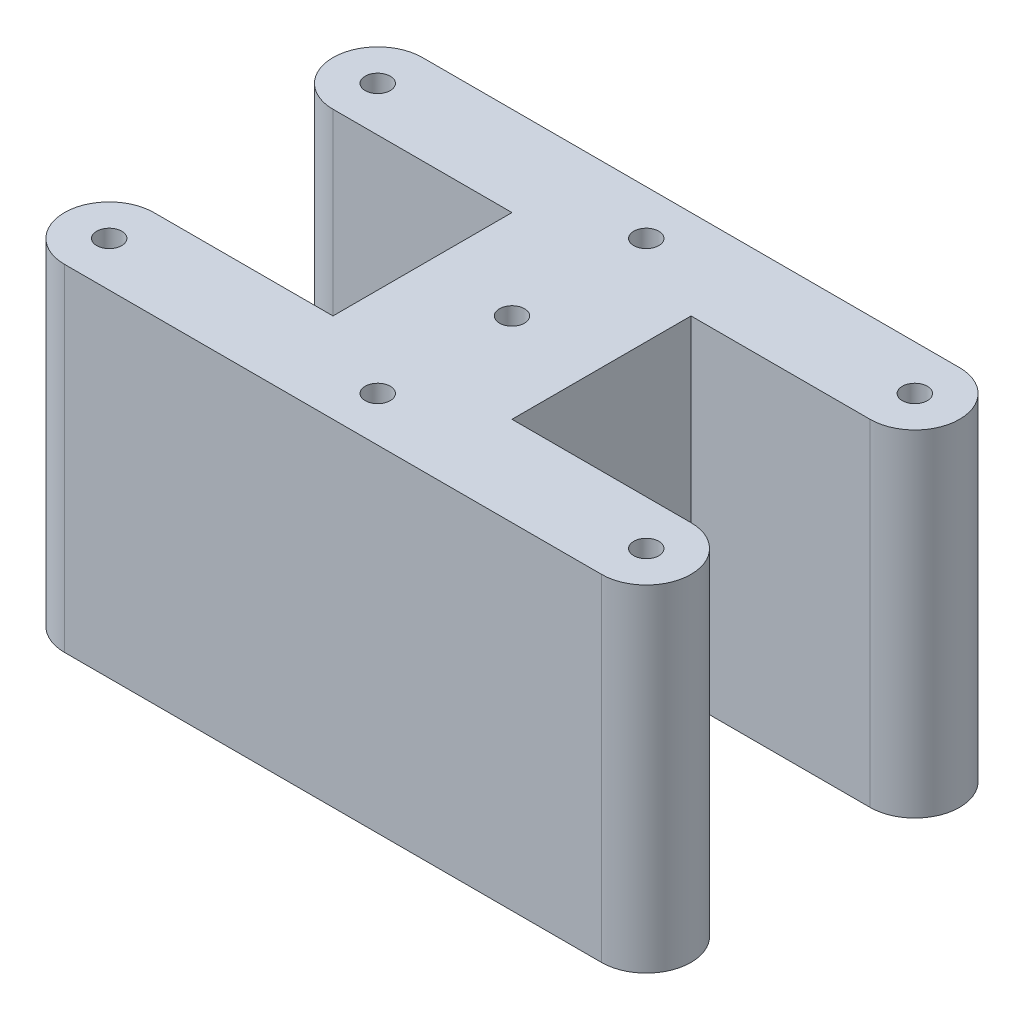
ISO-10303-21;
HEADER;
FILE_DESCRIPTION(('STEP AP214'),'2;1');
FILE_NAME('part.step','',(''),(''),'','','');
FILE_SCHEMA(('AUTOMOTIVE_DESIGN { 1 0 10303 214 1 1 1 1 }'));
ENDSEC;
DATA;
#1=APPLICATION_CONTEXT('core data for automotive mechanical design processes');
#2=APPLICATION_PROTOCOL_DEFINITION('international standard','automotive_design',2000,#1);
#3=PRODUCT_CONTEXT('',#1,'mechanical');
#4=PRODUCT('Part','Part','',(#3));
#5=PRODUCT_RELATED_PRODUCT_CATEGORY('part','',(#4));
#6=PRODUCT_DEFINITION_FORMATION('','',#4);
#7=PRODUCT_DEFINITION_CONTEXT('part definition',#1,'design');
#8=PRODUCT_DEFINITION('design','',#6,#7);
#9=PRODUCT_DEFINITION_SHAPE('','',#8);
#10=(LENGTH_UNIT() NAMED_UNIT(*) SI_UNIT(.MILLI.,.METRE.));
#11=(NAMED_UNIT(*) PLANE_ANGLE_UNIT() SI_UNIT($,.RADIAN.));
#12=(NAMED_UNIT(*) SI_UNIT($,.STERADIAN.) SOLID_ANGLE_UNIT());
#13=UNCERTAINTY_MEASURE_WITH_UNIT(LENGTH_MEASURE(1.E-05),#10,'distance_accuracy_value','');
#14=(GEOMETRIC_REPRESENTATION_CONTEXT(3) GLOBAL_UNCERTAINTY_ASSIGNED_CONTEXT((#13)) GLOBAL_UNIT_ASSIGNED_CONTEXT((#10,
#11,#12)) REPRESENTATION_CONTEXT('',''));
#15=CARTESIAN_POINT('',(0.,0.,0.));
#16=DIRECTION('',(0.,0.,1.));
#17=DIRECTION('',(1.,0.,0.));
#18=AXIS2_PLACEMENT_3D('',#15,#16,#17);
#19=CARTESIAN_POINT('',(24.448985647072,37.55,-14.1504172526963));
#20=DIRECTION('',(0.,-1.,0.));
#21=DIRECTION('',(0.,0.,-1.));
#22=AXIS2_PLACEMENT_3D('',#19,#20,#21);
#23=PLANE('',#22);
#24=CARTESIAN_POINT('',(24.448985647072,37.55,-14.1504172526963));
#25=DIRECTION('',(0.,1.,0.));
#26=DIRECTION('',(0.,0.,-1.));
#27=AXIS2_PLACEMENT_3D('',#24,#25,#26);
#28=CIRCLE('',#27,4.99999999999941);
#29=CARTESIAN_POINT('',(24.448985647072,37.55,-9.15041725269688));
#30=VERTEX_POINT('',#29);
#31=CARTESIAN_POINT('',(24.448985647072,37.55,-19.1504172526957));
#32=VERTEX_POINT('',#31);
#33=EDGE_CURVE('E179',#30,#32,#28,.T.);
#34=ORIENTED_EDGE('',*,*,#33,.T.);
#35=DIRECTION('',(-1.,0.,0.));
#36=VECTOR('',#35,1.);
#37=CARTESIAN_POINT('',(-35.5510143529281,37.55,-19.1504172526957));
#38=LINE('',#37,#36);
#39=CARTESIAN_POINT('',(-35.5510143529281,37.55,-19.1504172526957));
#40=VERTEX_POINT('',#39);
#41=EDGE_CURVE('E107',#32,#40,#38,.T.);
#42=ORIENTED_EDGE('',*,*,#41,.T.);
#43=CARTESIAN_POINT('',(-35.5510143529281,37.55,-14.1504172526963));
#44=DIRECTION('',(0.,1.,0.));
#45=DIRECTION('',(0.,0.,1.));
#46=AXIS2_PLACEMENT_3D('',#43,#44,#45);
#47=CIRCLE('',#46,4.99999999999941);
#48=CARTESIAN_POINT('',(-35.5510143529281,37.55,-9.15041725269687));
#49=VERTEX_POINT('',#48);
#50=EDGE_CURVE('E206',#40,#49,#47,.T.);
#51=ORIENTED_EDGE('',*,*,#50,.T.);
#52=DIRECTION('',(1.,0.,0.));
#53=VECTOR('',#52,1.);
#54=CARTESIAN_POINT('',(-15.5510143529274,37.55,-9.15041725269688));
#55=LINE('',#54,#53);
#56=CARTESIAN_POINT('',(-15.5510143529274,37.55,-9.15041725269688));
#57=VERTEX_POINT('',#56);
#58=EDGE_CURVE('E225',#49,#57,#55,.T.);
#59=ORIENTED_EDGE('',*,*,#58,.T.);
#60=DIRECTION('',(0.,0.,1.));
#61=VECTOR('',#60,1.);
#62=CARTESIAN_POINT('',(-15.5510143529274,37.55,10.8495827473053));
#63=LINE('',#62,#61);
#64=CARTESIAN_POINT('',(-15.5510143529274,37.55,10.8495827473053));
#65=VERTEX_POINT('',#64);
#66=EDGE_CURVE('E222',#57,#65,#63,.T.);
#67=ORIENTED_EDGE('',*,*,#66,.T.);
#68=DIRECTION('',(-1.,0.,0.));
#69=VECTOR('',#68,1.);
#70=CARTESIAN_POINT('',(-15.5510143529274,37.55,10.8495827473053));
#71=LINE('',#70,#69);
#72=CARTESIAN_POINT('',(-35.5510143529287,37.55,10.8495827473053));
#73=VERTEX_POINT('',#72);
#74=EDGE_CURVE('E224',#65,#73,#71,.T.);
#75=ORIENTED_EDGE('',*,*,#74,.T.);
#76=CARTESIAN_POINT('',(-35.551014352928,37.55,15.8495827473047));
#77=DIRECTION('',(0.,1.,0.));
#78=DIRECTION('',(0.,0.,-1.));
#79=AXIS2_PLACEMENT_3D('',#76,#77,#78);
#80=CIRCLE('',#79,4.99999999999942);
#81=CARTESIAN_POINT('',(-35.5510143529275,37.55,20.8495827473042));
#82=VERTEX_POINT('',#81);
#83=EDGE_CURVE('E227',#73,#82,#80,.T.);
#84=ORIENTED_EDGE('',*,*,#83,.T.);
#85=DIRECTION('',(1.,0.,0.));
#86=VECTOR('',#85,1.);
#87=CARTESIAN_POINT('',(-35.5510143529275,37.55,20.8495827473042));
#88=LINE('',#87,#86);
#89=CARTESIAN_POINT('',(24.4489856470714,37.55,20.8495827473042));
#90=VERTEX_POINT('',#89);
#91=EDGE_CURVE('E233',#82,#90,#88,.T.);
#92=ORIENTED_EDGE('',*,*,#91,.T.);
#93=CARTESIAN_POINT('',(24.448985647072,37.55,15.8495827473047));
#94=DIRECTION('',(0.,1.,0.));
#95=DIRECTION('',(0.,0.,1.));
#96=AXIS2_PLACEMENT_3D('',#93,#94,#95);
#97=CIRCLE('',#96,4.99999999999941);
#98=CARTESIAN_POINT('',(24.4489856470726,37.55,10.8495827473053));
#99=VERTEX_POINT('',#98);
#100=EDGE_CURVE('E138',#90,#99,#97,.T.);
#101=ORIENTED_EDGE('',*,*,#100,.T.);
#102=DIRECTION('',(-1.,0.,0.));
#103=VECTOR('',#102,1.);
#104=CARTESIAN_POINT('',(4.44898564707136,37.55,10.8495827473053));
#105=LINE('',#104,#103);
#106=CARTESIAN_POINT('',(4.44898564707136,37.55,10.8495827473053));
#107=VERTEX_POINT('',#106);
#108=EDGE_CURVE('E132',#99,#107,#105,.T.);
#109=ORIENTED_EDGE('',*,*,#108,.T.);
#110=DIRECTION('',(0.,0.,-1.));
#111=VECTOR('',#110,1.);
#112=CARTESIAN_POINT('',(4.44898564707136,37.55,10.8495827473053));
#113=LINE('',#112,#111);
#114=CARTESIAN_POINT('',(4.44898564707136,37.55,-9.15041725269688));
#115=VERTEX_POINT('',#114);
#116=EDGE_CURVE('E136',#107,#115,#113,.T.);
#117=ORIENTED_EDGE('',*,*,#116,.T.);
#118=DIRECTION('',(1.,0.,0.));
#119=VECTOR('',#118,1.);
#120=CARTESIAN_POINT('',(4.44898564707136,37.55,-9.15041725269688));
#121=LINE('',#120,#119);
#122=EDGE_CURVE('E52',#115,#30,#121,.T.);
#123=ORIENTED_EDGE('',*,*,#122,.T.);
#124=EDGE_LOOP('',(#34,#42,#51,#59,#67,#75,#84,#92,#101,#109,#117,#123));
#125=FACE_BOUND('',#124,.T.);
#126=CARTESIAN_POINT('',(24.448985647072,37.55,-14.1504172526963));
#127=DIRECTION('',(0.,1.,0.));
#128=DIRECTION('',(0.,0.,1.));
#129=AXIS2_PLACEMENT_3D('',#126,#127,#128);
#130=CIRCLE('',#129,1.39999999999933);
#131=CARTESIAN_POINT('',(24.448985647072,37.55,-12.750417252697));
#132=VERTEX_POINT('',#131);
#133=EDGE_CURVE('E160',#132,#132,#130,.T.);
#134=ORIENTED_EDGE('',*,*,#133,.F.);
#135=EDGE_LOOP('',(#134));
#136=FACE_BOUND('',#135,.T.);
#137=CARTESIAN_POINT('',(24.448985647072,37.55,15.8495827473047));
#138=DIRECTION('',(0.,1.,0.));
#139=DIRECTION('',(0.,0.,-1.));
#140=AXIS2_PLACEMENT_3D('',#137,#138,#139);
#141=CIRCLE('',#140,1.40000000000056);
#142=CARTESIAN_POINT('',(24.448985647072,37.55,14.4495827473042));
#143=VERTEX_POINT('',#142);
#144=EDGE_CURVE('E327',#143,#143,#141,.T.);
#145=ORIENTED_EDGE('',*,*,#144,.F.);
#146=EDGE_LOOP('',(#145));
#147=FACE_BOUND('',#146,.T.);
#148=CARTESIAN_POINT('',(-5.55101435292803,37.55,-14.150417252694));
#149=DIRECTION('',(0.,1.,0.));
#150=DIRECTION('',(0.,0.,1.));
#151=AXIS2_PLACEMENT_3D('',#148,#149,#150);
#152=CIRCLE('',#151,1.4);
#153=CARTESIAN_POINT('',(-5.55101435292803,37.55,-12.750417252694));
#154=VERTEX_POINT('',#153);
#155=EDGE_CURVE('E321',#154,#154,#152,.T.);
#156=ORIENTED_EDGE('',*,*,#155,.F.);
#157=EDGE_LOOP('',(#156));
#158=FACE_BOUND('',#157,.T.);
#159=CARTESIAN_POINT('',(-5.55101435292803,37.55,0.849582747304221));
#160=DIRECTION('',(0.,1.,0.));
#161=DIRECTION('',(0.,0.,1.));
#162=AXIS2_PLACEMENT_3D('',#159,#160,#161);
#163=CIRCLE('',#162,1.39999999999941);
#164=CARTESIAN_POINT('',(-5.55101435292803,37.55,2.24958274730363));
#165=VERTEX_POINT('',#164);
#166=EDGE_CURVE('E315',#165,#165,#163,.T.);
#167=ORIENTED_EDGE('',*,*,#166,.F.);
#168=EDGE_LOOP('',(#167));
#169=FACE_BOUND('',#168,.T.);
#170=CARTESIAN_POINT('',(-35.551014352928,37.55,15.8495827473047));
#171=DIRECTION('',(0.,1.,0.));
#172=DIRECTION('',(0.,0.,1.));
#173=AXIS2_PLACEMENT_3D('',#170,#171,#172);
#174=CIRCLE('',#173,1.40000000000057);
#175=CARTESIAN_POINT('',(-35.551014352928,37.55,17.2495827473053));
#176=VERTEX_POINT('',#175);
#177=EDGE_CURVE('E309',#176,#176,#174,.T.);
#178=ORIENTED_EDGE('',*,*,#177,.F.);
#179=EDGE_LOOP('',(#178));
#180=FACE_BOUND('',#179,.T.);
#181=CARTESIAN_POINT('',(-5.55101435292803,37.55,15.8495827473023));
#182=DIRECTION('',(0.,1.,0.));
#183=DIRECTION('',(0.,0.,-1.));
#184=AXIS2_PLACEMENT_3D('',#181,#182,#183);
#185=CIRCLE('',#184,1.39999999999999);
#186=CARTESIAN_POINT('',(-5.55101435292803,37.55,14.4495827473023));
#187=VERTEX_POINT('',#186);
#188=EDGE_CURVE('E303',#187,#187,#185,.T.);
#189=ORIENTED_EDGE('',*,*,#188,.F.);
#190=EDGE_LOOP('',(#189));
#191=FACE_BOUND('',#190,.T.);
#192=CARTESIAN_POINT('',(-35.5510143529281,37.55,-14.1504172526963));
#193=DIRECTION('',(0.,1.,0.));
#194=DIRECTION('',(0.,0.,-1.));
#195=AXIS2_PLACEMENT_3D('',#192,#193,#194);
#196=CIRCLE('',#195,1.39999999999933);
#197=CARTESIAN_POINT('',(-35.5510143529281,37.55,-15.5504172526956));
#198=VERTEX_POINT('',#197);
#199=EDGE_CURVE('E294',#198,#198,#196,.T.);
#200=ORIENTED_EDGE('',*,*,#199,.F.);
#201=EDGE_LOOP('',(#200));
#202=FACE_BOUND('',#201,.T.);
#203=ADVANCED_FACE('F35',(#125,#136,#147,#158,#169,#180,#191,#202),#23,.F.);
#204=CARTESIAN_POINT('',(24.448985647072,0.,-14.1504172526963));
#205=DIRECTION('',(0.,-1.,0.));
#206=DIRECTION('',(0.,0.,-1.));
#207=AXIS2_PLACEMENT_3D('',#204,#205,#206);
#208=PLANE('',#207);
#209=CARTESIAN_POINT('',(-5.55101435292803,0.,15.8495827473023));
#210=DIRECTION('',(0.,1.,0.));
#211=DIRECTION('',(0.,0.,-1.));
#212=AXIS2_PLACEMENT_3D('',#209,#210,#211);
#213=CIRCLE('',#212,1.39999999999999);
#214=CARTESIAN_POINT('',(-5.55101435292803,0.,14.4495827473023));
#215=VERTEX_POINT('',#214);
#216=EDGE_CURVE('E300',#215,#215,#213,.T.);
#217=ORIENTED_EDGE('',*,*,#216,.T.);
#218=EDGE_LOOP('',(#217));
#219=FACE_BOUND('',#218,.T.);
#220=CARTESIAN_POINT('',(-5.55101435292803,0.,0.849582747304221));
#221=DIRECTION('',(0.,1.,0.));
#222=DIRECTION('',(0.,0.,1.));
#223=AXIS2_PLACEMENT_3D('',#220,#221,#222);
#224=CIRCLE('',#223,1.39999999999941);
#225=CARTESIAN_POINT('',(-5.55101435292803,0.,2.24958274730363));
#226=VERTEX_POINT('',#225);
#227=EDGE_CURVE('E312',#226,#226,#224,.T.);
#228=ORIENTED_EDGE('',*,*,#227,.T.);
#229=EDGE_LOOP('',(#228));
#230=FACE_BOUND('',#229,.T.);
#231=CARTESIAN_POINT('',(24.448985647072,0.,15.8495827473047));
#232=DIRECTION('',(0.,1.,0.));
#233=DIRECTION('',(0.,0.,-1.));
#234=AXIS2_PLACEMENT_3D('',#231,#232,#233);
#235=CIRCLE('',#234,1.40000000000056);
#236=CARTESIAN_POINT('',(24.448985647072,0.,14.4495827473042));
#237=VERTEX_POINT('',#236);
#238=EDGE_CURVE('E324',#237,#237,#235,.T.);
#239=ORIENTED_EDGE('',*,*,#238,.T.);
#240=EDGE_LOOP('',(#239));
#241=FACE_BOUND('',#240,.T.);
#242=CARTESIAN_POINT('',(24.448985647072,0.,-14.1504172526963));
#243=DIRECTION('',(0.,1.,0.));
#244=DIRECTION('',(0.,0.,-1.));
#245=AXIS2_PLACEMENT_3D('',#242,#243,#244);
#246=CIRCLE('',#245,4.99999999999941);
#247=CARTESIAN_POINT('',(24.448985647072,0.,-9.15041725269688));
#248=VERTEX_POINT('',#247);
#249=CARTESIAN_POINT('',(24.448985647072,0.,-19.1504172526957));
#250=VERTEX_POINT('',#249);
#251=EDGE_CURVE('E156',#248,#250,#246,.T.);
#252=ORIENTED_EDGE('',*,*,#251,.F.);
#253=DIRECTION('',(1.,0.,0.));
#254=VECTOR('',#253,1.);
#255=CARTESIAN_POINT('',(4.44898564707136,0.,-9.15041725269688));
#256=LINE('',#255,#254);
#257=CARTESIAN_POINT('',(4.44898564707136,0.,-9.15041725269688));
#258=VERTEX_POINT('',#257);
#259=EDGE_CURVE('E99',#258,#248,#256,.T.);
#260=ORIENTED_EDGE('',*,*,#259,.F.);
#261=DIRECTION('',(0.,0.,-1.));
#262=VECTOR('',#261,1.);
#263=CARTESIAN_POINT('',(4.44898564707136,0.,10.8495827473053));
#264=LINE('',#263,#262);
#265=CARTESIAN_POINT('',(4.44898564707136,0.,10.8495827473053));
#266=VERTEX_POINT('',#265);
#267=EDGE_CURVE('E93',#266,#258,#264,.T.);
#268=ORIENTED_EDGE('',*,*,#267,.F.);
#269=DIRECTION('',(-1.,0.,0.));
#270=VECTOR('',#269,1.);
#271=CARTESIAN_POINT('',(4.44898564707136,0.,10.8495827473053));
#272=LINE('',#271,#270);
#273=CARTESIAN_POINT('',(24.4489856470726,0.,10.8495827473053));
#274=VERTEX_POINT('',#273);
#275=EDGE_CURVE('E146',#274,#266,#272,.T.);
#276=ORIENTED_EDGE('',*,*,#275,.F.);
#277=CARTESIAN_POINT('',(24.448985647072,0.,15.8495827473047));
#278=DIRECTION('',(0.,1.,0.));
#279=DIRECTION('',(0.,0.,1.));
#280=AXIS2_PLACEMENT_3D('',#277,#278,#279);
#281=CIRCLE('',#280,4.99999999999941);
#282=CARTESIAN_POINT('',(24.4489856470714,0.,20.8495827473042));
#283=VERTEX_POINT('',#282);
#284=EDGE_CURVE('E174',#283,#274,#281,.T.);
#285=ORIENTED_EDGE('',*,*,#284,.F.);
#286=DIRECTION('',(1.,0.,0.));
#287=VECTOR('',#286,1.);
#288=CARTESIAN_POINT('',(-35.5510143529275,0.,20.8495827473042));
#289=LINE('',#288,#287);
#290=CARTESIAN_POINT('',(-35.5510143529275,0.,20.8495827473042));
#291=VERTEX_POINT('',#290);
#292=EDGE_CURVE('E172',#291,#283,#289,.T.);
#293=ORIENTED_EDGE('',*,*,#292,.F.);
#294=CARTESIAN_POINT('',(-35.551014352928,0.,15.8495827473047));
#295=DIRECTION('',(0.,1.,0.));
#296=DIRECTION('',(0.,0.,-1.));
#297=AXIS2_PLACEMENT_3D('',#294,#295,#296);
#298=CIRCLE('',#297,4.99999999999942);
#299=CARTESIAN_POINT('',(-35.5510143529287,0.,10.8495827473053));
#300=VERTEX_POINT('',#299);
#301=EDGE_CURVE('E170',#300,#291,#298,.T.);
#302=ORIENTED_EDGE('',*,*,#301,.F.);
#303=DIRECTION('',(-1.,0.,0.));
#304=VECTOR('',#303,1.);
#305=CARTESIAN_POINT('',(-15.5510143529274,0.,10.8495827473053));
#306=LINE('',#305,#304);
#307=CARTESIAN_POINT('',(-15.5510143529274,0.,10.8495827473053));
#308=VERTEX_POINT('',#307);
#309=EDGE_CURVE('E168',#308,#300,#306,.T.);
#310=ORIENTED_EDGE('',*,*,#309,.F.);
#311=DIRECTION('',(0.,0.,1.));
#312=VECTOR('',#311,1.);
#313=CARTESIAN_POINT('',(-15.5510143529274,0.,10.8495827473053));
#314=LINE('',#313,#312);
#315=CARTESIAN_POINT('',(-15.5510143529274,0.,-9.15041725269688));
#316=VERTEX_POINT('',#315);
#317=EDGE_CURVE('E166',#316,#308,#314,.T.);
#318=ORIENTED_EDGE('',*,*,#317,.F.);
#319=DIRECTION('',(1.,0.,0.));
#320=VECTOR('',#319,1.);
#321=CARTESIAN_POINT('',(-15.5510143529274,0.,-9.15041725269688));
#322=LINE('',#321,#320);
#323=CARTESIAN_POINT('',(-35.5510143529281,0.,-9.15041725269687));
#324=VERTEX_POINT('',#323);
#325=EDGE_CURVE('E164',#324,#316,#322,.T.);
#326=ORIENTED_EDGE('',*,*,#325,.F.);
#327=CARTESIAN_POINT('',(-35.5510143529281,0.,-14.1504172526963));
#328=DIRECTION('',(0.,1.,0.));
#329=DIRECTION('',(0.,0.,1.));
#330=AXIS2_PLACEMENT_3D('',#327,#328,#329);
#331=CIRCLE('',#330,4.99999999999941);
#332=CARTESIAN_POINT('',(-35.5510143529281,0.,-19.1504172526957));
#333=VERTEX_POINT('',#332);
#334=EDGE_CURVE('E162',#333,#324,#331,.T.);
#335=ORIENTED_EDGE('',*,*,#334,.F.);
#336=DIRECTION('',(-1.,0.,0.));
#337=VECTOR('',#336,1.);
#338=CARTESIAN_POINT('',(-35.5510143529281,0.,-19.1504172526957));
#339=LINE('',#338,#337);
#340=EDGE_CURVE('E159',#250,#333,#339,.T.);
#341=ORIENTED_EDGE('',*,*,#340,.F.);
#342=EDGE_LOOP('',(#252,#260,#268,#276,#285,#293,#302,#310,#318,#326,#335,#341));
#343=FACE_BOUND('',#342,.T.);
#344=CARTESIAN_POINT('',(24.448985647072,0.,-14.1504172526963));
#345=DIRECTION('',(0.,1.,0.));
#346=DIRECTION('',(0.,0.,1.));
#347=AXIS2_PLACEMENT_3D('',#344,#345,#346);
#348=CIRCLE('',#347,1.39999999999933);
#349=CARTESIAN_POINT('',(24.448985647072,0.,-12.750417252697));
#350=VERTEX_POINT('',#349);
#351=EDGE_CURVE('E330',#350,#350,#348,.T.);
#352=ORIENTED_EDGE('',*,*,#351,.T.);
#353=EDGE_LOOP('',(#352));
#354=FACE_BOUND('',#353,.T.);
#355=CARTESIAN_POINT('',(-5.55101435292803,0.,-14.150417252694));
#356=DIRECTION('',(0.,1.,0.));
#357=DIRECTION('',(0.,0.,1.));
#358=AXIS2_PLACEMENT_3D('',#355,#356,#357);
#359=CIRCLE('',#358,1.4);
#360=CARTESIAN_POINT('',(-5.55101435292803,0.,-12.750417252694));
#361=VERTEX_POINT('',#360);
#362=EDGE_CURVE('E318',#361,#361,#359,.T.);
#363=ORIENTED_EDGE('',*,*,#362,.T.);
#364=EDGE_LOOP('',(#363));
#365=FACE_BOUND('',#364,.T.);
#366=CARTESIAN_POINT('',(-35.551014352928,0.,15.8495827473047));
#367=DIRECTION('',(0.,1.,0.));
#368=DIRECTION('',(0.,0.,1.));
#369=AXIS2_PLACEMENT_3D('',#366,#367,#368);
#370=CIRCLE('',#369,1.40000000000057);
#371=CARTESIAN_POINT('',(-35.551014352928,0.,17.2495827473053));
#372=VERTEX_POINT('',#371);
#373=EDGE_CURVE('E306',#372,#372,#370,.T.);
#374=ORIENTED_EDGE('',*,*,#373,.T.);
#375=EDGE_LOOP('',(#374));
#376=FACE_BOUND('',#375,.T.);
#377=CARTESIAN_POINT('',(-35.5510143529281,0.,-14.1504172526963));
#378=DIRECTION('',(0.,1.,0.));
#379=DIRECTION('',(0.,0.,-1.));
#380=AXIS2_PLACEMENT_3D('',#377,#378,#379);
#381=CIRCLE('',#380,1.39999999999933);
#382=CARTESIAN_POINT('',(-35.5510143529281,0.,-15.5504172526956));
#383=VERTEX_POINT('',#382);
#384=EDGE_CURVE('E297',#383,#383,#381,.T.);
#385=ORIENTED_EDGE('',*,*,#384,.T.);
#386=EDGE_LOOP('',(#385));
#387=FACE_BOUND('',#386,.T.);
#388=ADVANCED_FACE('F210',(#219,#230,#241,#343,#354,#365,#376,#387),#208,.T.);
#389=CARTESIAN_POINT('',(24.448985647072,37.55,-14.1504172526963));
#390=DIRECTION('',(0.,-1.,0.));
#391=DIRECTION('',(0.,0.,-1.));
#392=AXIS2_PLACEMENT_3D('',#389,#390,#391);
#393=CYLINDRICAL_SURFACE('',#392,4.99999999999941);
#394=ORIENTED_EDGE('',*,*,#251,.T.);
#395=DIRECTION('',(0.,-1.,0.));
#396=VECTOR('',#395,1.);
#397=CARTESIAN_POINT('',(24.448985647072,37.55,-19.1504172526957));
#398=LINE('',#397,#396);
#399=EDGE_CURVE('E11',#32,#250,#398,.T.);
#400=ORIENTED_EDGE('',*,*,#399,.F.);
#401=ORIENTED_EDGE('',*,*,#33,.F.);
#402=DIRECTION('',(0.,-1.,0.));
#403=VECTOR('',#402,1.);
#404=CARTESIAN_POINT('',(24.448985647072,37.55,-9.15041725269688));
#405=LINE('',#404,#403);
#406=EDGE_CURVE('E152',#30,#248,#405,.T.);
#407=ORIENTED_EDGE('',*,*,#406,.T.);
#408=EDGE_LOOP('',(#394,#400,#401,#407));
#409=FACE_BOUND('',#408,.T.);
#410=ADVANCED_FACE('F37',(#409),#393,.T.);
#411=CARTESIAN_POINT('',(-35.5510143529281,37.55,-19.1504172526957));
#412=DIRECTION('',(0.,0.,1.));
#413=DIRECTION('',(1.,0.,0.));
#414=AXIS2_PLACEMENT_3D('',#411,#412,#413);
#415=PLANE('',#414);
#416=ORIENTED_EDGE('',*,*,#340,.T.);
#417=DIRECTION('',(0.,-1.,0.));
#418=VECTOR('',#417,1.);
#419=CARTESIAN_POINT('',(-35.5510143529281,37.55,-19.1504172526957));
#420=LINE('',#419,#418);
#421=EDGE_CURVE('E44',#40,#333,#420,.T.);
#422=ORIENTED_EDGE('',*,*,#421,.F.);
#423=ORIENTED_EDGE('',*,*,#41,.F.);
#424=ORIENTED_EDGE('',*,*,#399,.T.);
#425=EDGE_LOOP('',(#416,#422,#423,#424));
#426=FACE_BOUND('',#425,.T.);
#427=ADVANCED_FACE('F469',(#426),#415,.F.);
#428=CARTESIAN_POINT('',(-35.5510143529281,37.55,-14.1504172526963));
#429=DIRECTION('',(0.,-1.,0.));
#430=DIRECTION('',(0.,0.,-1.));
#431=AXIS2_PLACEMENT_3D('',#428,#429,#430);
#432=CYLINDRICAL_SURFACE('',#431,4.99999999999941);
#433=ORIENTED_EDGE('',*,*,#334,.T.);
#434=DIRECTION('',(0.,-1.,0.));
#435=VECTOR('',#434,1.);
#436=CARTESIAN_POINT('',(-35.5510143529281,37.55,-9.15041725269687));
#437=LINE('',#436,#435);
#438=EDGE_CURVE('E198',#49,#324,#437,.T.);
#439=ORIENTED_EDGE('',*,*,#438,.F.);
#440=ORIENTED_EDGE('',*,*,#50,.F.);
#441=ORIENTED_EDGE('',*,*,#421,.T.);
#442=EDGE_LOOP('',(#433,#439,#440,#441));
#443=FACE_BOUND('',#442,.T.);
#444=ADVANCED_FACE('F204',(#443),#432,.T.);
#445=CARTESIAN_POINT('',(-15.5510143529274,37.55,-9.15041725269688));
#446=DIRECTION('',(0.,0.,-1.));
#447=DIRECTION('',(-1.,0.,0.));
#448=AXIS2_PLACEMENT_3D('',#445,#446,#447);
#449=PLANE('',#448);
#450=ORIENTED_EDGE('',*,*,#325,.T.);
#451=DIRECTION('',(0.,-1.,0.));
#452=VECTOR('',#451,1.);
#453=CARTESIAN_POINT('',(-15.5510143529274,37.55,-9.15041725269688));
#454=LINE('',#453,#452);
#455=EDGE_CURVE('E195',#57,#316,#454,.T.);
#456=ORIENTED_EDGE('',*,*,#455,.F.);
#457=ORIENTED_EDGE('',*,*,#58,.F.);
#458=ORIENTED_EDGE('',*,*,#438,.T.);
#459=EDGE_LOOP('',(#450,#456,#457,#458));
#460=FACE_BOUND('',#459,.T.);
#461=ADVANCED_FACE('F216',(#460),#449,.F.);
#462=CARTESIAN_POINT('',(-15.5510143529274,37.55,10.8495827473053));
#463=DIRECTION('',(1.,0.,0.));
#464=DIRECTION('',(0.,0.,-1.));
#465=AXIS2_PLACEMENT_3D('',#462,#463,#464);
#466=PLANE('',#465);
#467=ORIENTED_EDGE('',*,*,#317,.T.);
#468=DIRECTION('',(0.,-1.,0.));
#469=VECTOR('',#468,1.);
#470=CARTESIAN_POINT('',(-15.5510143529274,37.55,10.8495827473053));
#471=LINE('',#470,#469);
#472=EDGE_CURVE('E192',#65,#308,#471,.T.);
#473=ORIENTED_EDGE('',*,*,#472,.F.);
#474=ORIENTED_EDGE('',*,*,#66,.F.);
#475=ORIENTED_EDGE('',*,*,#455,.T.);
#476=EDGE_LOOP('',(#467,#473,#474,#475));
#477=FACE_BOUND('',#476,.T.);
#478=ADVANCED_FACE('F220',(#477),#466,.F.);
#479=CARTESIAN_POINT('',(-15.5510143529274,37.55,10.8495827473053));
#480=DIRECTION('',(0.,0.,1.));
#481=DIRECTION('',(1.,0.,0.));
#482=AXIS2_PLACEMENT_3D('',#479,#480,#481);
#483=PLANE('',#482);
#484=ORIENTED_EDGE('',*,*,#309,.T.);
#485=DIRECTION('',(0.,-1.,0.));
#486=VECTOR('',#485,1.);
#487=CARTESIAN_POINT('',(-35.5510143529287,37.55,10.8495827473053));
#488=LINE('',#487,#486);
#489=EDGE_CURVE('E189',#73,#300,#488,.T.);
#490=ORIENTED_EDGE('',*,*,#489,.F.);
#491=ORIENTED_EDGE('',*,*,#74,.F.);
#492=ORIENTED_EDGE('',*,*,#472,.T.);
#493=EDGE_LOOP('',(#484,#490,#491,#492));
#494=FACE_BOUND('',#493,.T.);
#495=ADVANCED_FACE('F434',(#494),#483,.F.);
#496=CARTESIAN_POINT('',(-35.551014352928,37.55,15.8495827473047));
#497=DIRECTION('',(0.,-1.,0.));
#498=DIRECTION('',(0.,0.,-1.));
#499=AXIS2_PLACEMENT_3D('',#496,#497,#498);
#500=CYLINDRICAL_SURFACE('',#499,4.99999999999942);
#501=ORIENTED_EDGE('',*,*,#301,.T.);
#502=DIRECTION('',(0.,-1.,0.));
#503=VECTOR('',#502,1.);
#504=CARTESIAN_POINT('',(-35.5510143529275,37.55,20.8495827473042));
#505=LINE('',#504,#503);
#506=EDGE_CURVE('E186',#82,#291,#505,.T.);
#507=ORIENTED_EDGE('',*,*,#506,.F.);
#508=ORIENTED_EDGE('',*,*,#83,.F.);
#509=ORIENTED_EDGE('',*,*,#489,.T.);
#510=EDGE_LOOP('',(#501,#507,#508,#509));
#511=FACE_BOUND('',#510,.T.);
#512=ADVANCED_FACE('F425',(#511),#500,.T.);
#513=CARTESIAN_POINT('',(-35.5510143529275,37.55,20.8495827473042));
#514=DIRECTION('',(0.,0.,-1.));
#515=DIRECTION('',(-1.,0.,0.));
#516=AXIS2_PLACEMENT_3D('',#513,#514,#515);
#517=PLANE('',#516);
#518=ORIENTED_EDGE('',*,*,#292,.T.);
#519=DIRECTION('',(0.,-1.,0.));
#520=VECTOR('',#519,1.);
#521=CARTESIAN_POINT('',(24.4489856470714,37.55,20.8495827473042));
#522=LINE('',#521,#520);
#523=EDGE_CURVE('E183',#90,#283,#522,.T.);
#524=ORIENTED_EDGE('',*,*,#523,.F.);
#525=ORIENTED_EDGE('',*,*,#91,.F.);
#526=ORIENTED_EDGE('',*,*,#506,.T.);
#527=EDGE_LOOP('',(#518,#524,#525,#526));
#528=FACE_BOUND('',#527,.T.);
#529=ADVANCED_FACE('F239',(#528),#517,.F.);
#530=CARTESIAN_POINT('',(24.448985647072,37.55,15.8495827473047));
#531=DIRECTION('',(0.,-1.,0.));
#532=DIRECTION('',(0.,0.,-1.));
#533=AXIS2_PLACEMENT_3D('',#530,#531,#532);
#534=CYLINDRICAL_SURFACE('',#533,4.99999999999941);
#535=ORIENTED_EDGE('',*,*,#284,.T.);
#536=DIRECTION('',(0.,-1.,0.));
#537=VECTOR('',#536,1.);
#538=CARTESIAN_POINT('',(24.4489856470726,37.55,10.8495827473053));
#539=LINE('',#538,#537);
#540=EDGE_CURVE('E147',#99,#274,#539,.T.);
#541=ORIENTED_EDGE('',*,*,#540,.F.);
#542=ORIENTED_EDGE('',*,*,#100,.F.);
#543=ORIENTED_EDGE('',*,*,#523,.T.);
#544=EDGE_LOOP('',(#535,#541,#542,#543));
#545=FACE_BOUND('',#544,.T.);
#546=ADVANCED_FACE('F243',(#545),#534,.T.);
#547=CARTESIAN_POINT('',(4.44898564707136,37.55,10.8495827473053));
#548=DIRECTION('',(0.,0.,1.));
#549=DIRECTION('',(1.,0.,0.));
#550=AXIS2_PLACEMENT_3D('',#547,#548,#549);
#551=PLANE('',#550);
#552=ORIENTED_EDGE('',*,*,#275,.T.);
#553=DIRECTION('',(0.,-1.,0.));
#554=VECTOR('',#553,1.);
#555=CARTESIAN_POINT('',(4.44898564707136,37.55,10.8495827473053));
#556=LINE('',#555,#554);
#557=EDGE_CURVE('E143',#107,#266,#556,.T.);
#558=ORIENTED_EDGE('',*,*,#557,.F.);
#559=ORIENTED_EDGE('',*,*,#108,.F.);
#560=ORIENTED_EDGE('',*,*,#540,.T.);
#561=EDGE_LOOP('',(#552,#558,#559,#560));
#562=FACE_BOUND('',#561,.T.);
#563=ADVANCED_FACE('F144',(#562),#551,.F.);
#564=CARTESIAN_POINT('',(4.44898564707136,37.55,10.8495827473053));
#565=DIRECTION('',(-1.,0.,0.));
#566=DIRECTION('',(0.,0.,1.));
#567=AXIS2_PLACEMENT_3D('',#564,#565,#566);
#568=PLANE('',#567);
#569=ORIENTED_EDGE('',*,*,#267,.T.);
#570=DIRECTION('',(0.,-1.,0.));
#571=VECTOR('',#570,1.);
#572=CARTESIAN_POINT('',(4.44898564707136,37.55,-9.15041725269688));
#573=LINE('',#572,#571);
#574=EDGE_CURVE('E148',#115,#258,#573,.T.);
#575=ORIENTED_EDGE('',*,*,#574,.F.);
#576=ORIENTED_EDGE('',*,*,#116,.F.);
#577=ORIENTED_EDGE('',*,*,#557,.T.);
#578=EDGE_LOOP('',(#569,#575,#576,#577));
#579=FACE_BOUND('',#578,.T.);
#580=ADVANCED_FACE('F150',(#579),#568,.F.);
#581=CARTESIAN_POINT('',(4.44898564707136,37.55,-9.15041725269688));
#582=DIRECTION('',(0.,0.,-1.));
#583=DIRECTION('',(-1.,0.,0.));
#584=AXIS2_PLACEMENT_3D('',#581,#582,#583);
#585=PLANE('',#584);
#586=ORIENTED_EDGE('',*,*,#259,.T.);
#587=ORIENTED_EDGE('',*,*,#406,.F.);
#588=ORIENTED_EDGE('',*,*,#122,.F.);
#589=ORIENTED_EDGE('',*,*,#574,.T.);
#590=EDGE_LOOP('',(#586,#587,#588,#589));
#591=FACE_BOUND('',#590,.T.);
#592=ADVANCED_FACE('F247',(#591),#585,.F.);
#593=CARTESIAN_POINT('',(24.448985647072,37.55,-14.1504172526963));
#594=DIRECTION('',(0.,-1.,0.));
#595=DIRECTION('',(0.,0.,-1.));
#596=AXIS2_PLACEMENT_3D('',#593,#594,#595);
#597=CYLINDRICAL_SURFACE('',#596,1.39999999999933);
#598=ORIENTED_EDGE('',*,*,#133,.T.);
#599=EDGE_LOOP('',(#598));
#600=FACE_BOUND('',#599,.T.);
#601=ORIENTED_EDGE('',*,*,#351,.F.);
#602=EDGE_LOOP('',(#601));
#603=FACE_BOUND('',#602,.T.);
#604=ADVANCED_FACE('F249',(#600,#603),#597,.F.);
#605=CARTESIAN_POINT('',(24.448985647072,37.55,15.8495827473047));
#606=DIRECTION('',(0.,-1.,0.));
#607=DIRECTION('',(0.,0.,-1.));
#608=AXIS2_PLACEMENT_3D('',#605,#606,#607);
#609=CYLINDRICAL_SURFACE('',#608,1.40000000000056);
#610=ORIENTED_EDGE('',*,*,#144,.T.);
#611=EDGE_LOOP('',(#610));
#612=FACE_BOUND('',#611,.T.);
#613=ORIENTED_EDGE('',*,*,#238,.F.);
#614=EDGE_LOOP('',(#613));
#615=FACE_BOUND('',#614,.T.);
#616=ADVANCED_FACE('F255',(#612,#615),#609,.F.);
#617=CARTESIAN_POINT('',(-5.55101435292803,37.55,-14.150417252694));
#618=DIRECTION('',(0.,-1.,0.));
#619=DIRECTION('',(0.,0.,-1.));
#620=AXIS2_PLACEMENT_3D('',#617,#618,#619);
#621=CYLINDRICAL_SURFACE('',#620,1.4);
#622=ORIENTED_EDGE('',*,*,#155,.T.);
#623=EDGE_LOOP('',(#622));
#624=FACE_BOUND('',#623,.T.);
#625=ORIENTED_EDGE('',*,*,#362,.F.);
#626=EDGE_LOOP('',(#625));
#627=FACE_BOUND('',#626,.T.);
#628=ADVANCED_FACE('F269',(#624,#627),#621,.F.);
#629=CARTESIAN_POINT('',(-5.55101435292803,37.55,0.849582747304221));
#630=DIRECTION('',(0.,-1.,0.));
#631=DIRECTION('',(0.,0.,-1.));
#632=AXIS2_PLACEMENT_3D('',#629,#630,#631);
#633=CYLINDRICAL_SURFACE('',#632,1.39999999999941);
#634=ORIENTED_EDGE('',*,*,#166,.T.);
#635=EDGE_LOOP('',(#634));
#636=FACE_BOUND('',#635,.T.);
#637=ORIENTED_EDGE('',*,*,#227,.F.);
#638=EDGE_LOOP('',(#637));
#639=FACE_BOUND('',#638,.T.);
#640=ADVANCED_FACE('F273',(#636,#639),#633,.F.);
#641=CARTESIAN_POINT('',(-35.551014352928,37.55,15.8495827473047));
#642=DIRECTION('',(0.,-1.,0.));
#643=DIRECTION('',(0.,0.,-1.));
#644=AXIS2_PLACEMENT_3D('',#641,#642,#643);
#645=CYLINDRICAL_SURFACE('',#644,1.40000000000057);
#646=ORIENTED_EDGE('',*,*,#177,.T.);
#647=EDGE_LOOP('',(#646));
#648=FACE_BOUND('',#647,.T.);
#649=ORIENTED_EDGE('',*,*,#373,.F.);
#650=EDGE_LOOP('',(#649));
#651=FACE_BOUND('',#650,.T.);
#652=ADVANCED_FACE('F277',(#648,#651),#645,.F.);
#653=CARTESIAN_POINT('',(-5.55101435292803,37.55,15.8495827473023));
#654=DIRECTION('',(0.,-1.,0.));
#655=DIRECTION('',(0.,0.,-1.));
#656=AXIS2_PLACEMENT_3D('',#653,#654,#655);
#657=CYLINDRICAL_SURFACE('',#656,1.39999999999999);
#658=ORIENTED_EDGE('',*,*,#188,.T.);
#659=EDGE_LOOP('',(#658));
#660=FACE_BOUND('',#659,.T.);
#661=ORIENTED_EDGE('',*,*,#216,.F.);
#662=EDGE_LOOP('',(#661));
#663=FACE_BOUND('',#662,.T.);
#664=ADVANCED_FACE('F281',(#660,#663),#657,.F.);
#665=CARTESIAN_POINT('',(-35.5510143529281,37.55,-14.1504172526963));
#666=DIRECTION('',(0.,-1.,0.));
#667=DIRECTION('',(0.,0.,-1.));
#668=AXIS2_PLACEMENT_3D('',#665,#666,#667);
#669=CYLINDRICAL_SURFACE('',#668,1.39999999999933);
#670=ORIENTED_EDGE('',*,*,#199,.T.);
#671=EDGE_LOOP('',(#670));
#672=FACE_BOUND('',#671,.T.);
#673=ORIENTED_EDGE('',*,*,#384,.F.);
#674=EDGE_LOOP('',(#673));
#675=FACE_BOUND('',#674,.T.);
#676=ADVANCED_FACE('F285',(#672,#675),#669,.F.);
#677=CLOSED_SHELL('',(#203,#388,#410,#427,#444,#461,#478,#495,#512,#529,#546,#563,#580,#592,
#604,#616,#628,#640,#652,#664,#676));
#678=MANIFOLD_SOLID_BREP('B2',#677);
#679=ADVANCED_BREP_SHAPE_REPRESENTATION('',(#18,#678),#14);
#680=SHAPE_DEFINITION_REPRESENTATION(#9,#679);
ENDSEC;
END-ISO-10303-21;
